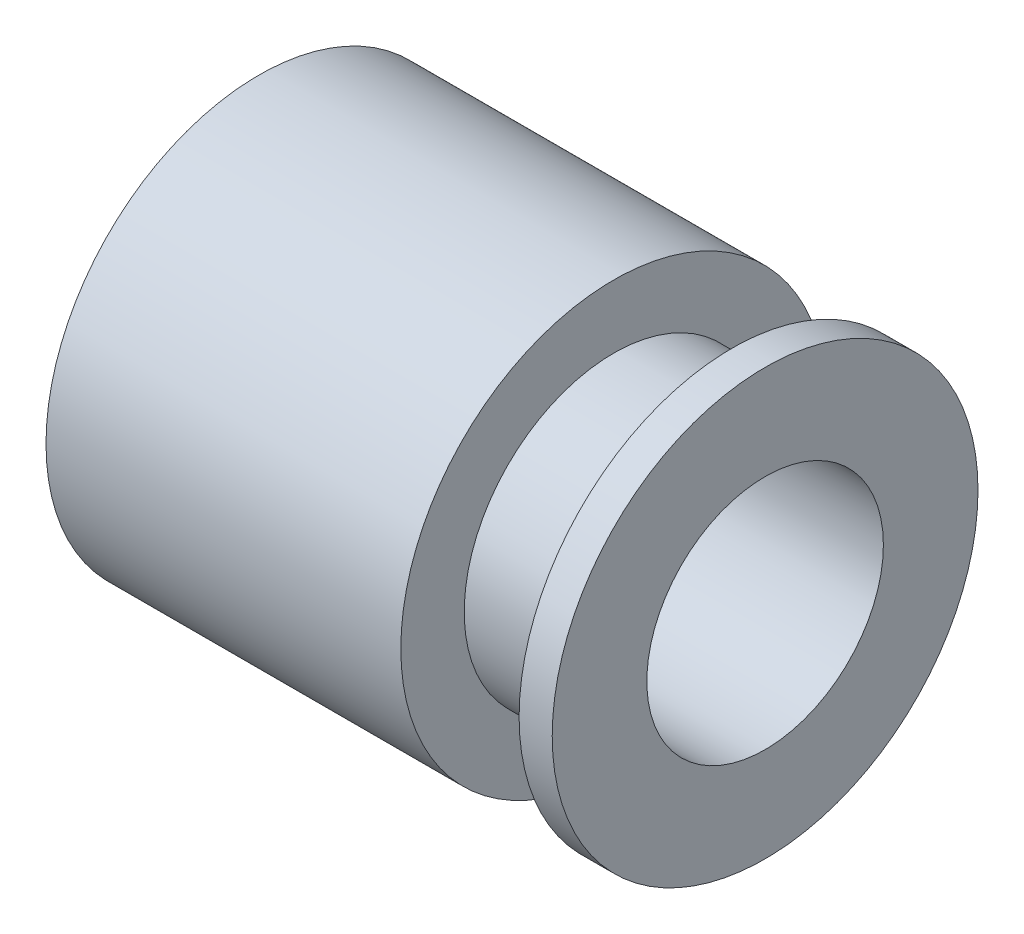
ISO-10303-21;
HEADER;
FILE_DESCRIPTION(('STEP AP214'),'2;1');
FILE_NAME('part.step','',(''),(''),'','','');
FILE_SCHEMA(('AUTOMOTIVE_DESIGN { 1 0 10303 214 1 1 1 1 }'));
ENDSEC;
DATA;
#1=APPLICATION_CONTEXT('core data for automotive mechanical design processes');
#2=APPLICATION_PROTOCOL_DEFINITION('international standard','automotive_design',2000,#1);
#3=PRODUCT_CONTEXT('',#1,'mechanical');
#4=PRODUCT('Part','Part','',(#3));
#5=PRODUCT_RELATED_PRODUCT_CATEGORY('part','',(#4));
#6=PRODUCT_DEFINITION_FORMATION('','',#4);
#7=PRODUCT_DEFINITION_CONTEXT('part definition',#1,'design');
#8=PRODUCT_DEFINITION('design','',#6,#7);
#9=PRODUCT_DEFINITION_SHAPE('','',#8);
#10=(LENGTH_UNIT() NAMED_UNIT(*) SI_UNIT(.MILLI.,.METRE.));
#11=(NAMED_UNIT(*) PLANE_ANGLE_UNIT() SI_UNIT($,.RADIAN.));
#12=(NAMED_UNIT(*) SI_UNIT($,.STERADIAN.) SOLID_ANGLE_UNIT());
#13=UNCERTAINTY_MEASURE_WITH_UNIT(LENGTH_MEASURE(1.E-05),#10,'distance_accuracy_value','');
#14=(GEOMETRIC_REPRESENTATION_CONTEXT(3) GLOBAL_UNCERTAINTY_ASSIGNED_CONTEXT((#13)) GLOBAL_UNIT_ASSIGNED_CONTEXT((#10,
#11,#12)) REPRESENTATION_CONTEXT('',''));
#15=CARTESIAN_POINT('',(0.,0.,0.));
#16=DIRECTION('',(0.,0.,1.));
#17=DIRECTION('',(1.,0.,0.));
#18=AXIS2_PLACEMENT_3D('',#15,#16,#17);
#19=CARTESIAN_POINT('',(0.,0.,0.));
#20=DIRECTION('',(1.,0.,0.));
#21=DIRECTION('',(0.,0.,-1.));
#22=AXIS2_PLACEMENT_3D('',#19,#20,#21);
#23=CYLINDRICAL_SURFACE('',#22,3.175);
#24=CARTESIAN_POINT('',(13.589,0.,0.));
#25=DIRECTION('',(1.,0.,0.));
#26=DIRECTION('',(0.,0.,-1.));
#27=AXIS2_PLACEMENT_3D('',#24,#25,#26);
#28=CIRCLE('',#27,3.175);
#29=CARTESIAN_POINT('',(13.589,0.,-3.175));
#30=VERTEX_POINT('',#29);
#31=EDGE_CURVE('E55',#30,#30,#28,.T.);
#32=ORIENTED_EDGE('',*,*,#31,.T.);
#33=EDGE_LOOP('',(#32));
#34=FACE_BOUND('',#33,.T.);
#35=CARTESIAN_POINT('',(8.255,0.,0.));
#36=DIRECTION('',(-1.,0.,0.));
#37=DIRECTION('',(0.,0.,1.));
#38=AXIS2_PLACEMENT_3D('',#35,#36,#37);
#39=CIRCLE('',#38,3.175);
#40=CARTESIAN_POINT('',(8.255,0.,3.175));
#41=VERTEX_POINT('',#40);
#42=EDGE_CURVE('E35',#41,#41,#39,.F.);
#43=ORIENTED_EDGE('',*,*,#42,.F.);
#44=EDGE_LOOP('',(#43));
#45=FACE_BOUND('',#44,.T.);
#46=ADVANCED_FACE('F31',(#34,#45),#23,.F.);
#47=CARTESIAN_POINT('',(9.525,0.,0.));
#48=DIRECTION('',(1.,0.,0.));
#49=DIRECTION('',(0.,0.,-1.));
#50=AXIS2_PLACEMENT_3D('',#47,#48,#49);
#51=PLANE('',#50);
#52=CARTESIAN_POINT('',(9.525,0.,0.));
#53=DIRECTION('',(1.,0.,0.));
#54=DIRECTION('',(0.,0.,-1.));
#55=AXIS2_PLACEMENT_3D('',#52,#53,#54);
#56=CIRCLE('',#55,5.715);
#57=CARTESIAN_POINT('',(9.525,0.,5.715));
#58=VERTEX_POINT('',#57);
#59=EDGE_CURVE('E10',#58,#58,#56,.T.);
#60=ORIENTED_EDGE('',*,*,#59,.T.);
#61=EDGE_LOOP('',(#60));
#62=FACE_BOUND('',#61,.T.);
#63=CARTESIAN_POINT('',(9.525,0.,0.));
#64=DIRECTION('',(1.,0.,0.));
#65=DIRECTION('',(0.,0.,-1.));
#66=AXIS2_PLACEMENT_3D('',#63,#64,#65);
#67=CIRCLE('',#66,4.0132);
#68=CARTESIAN_POINT('',(9.525,0.,-4.0132));
#69=VERTEX_POINT('',#68);
#70=EDGE_CURVE('E46',#69,#69,#67,.T.);
#71=ORIENTED_EDGE('',*,*,#70,.F.);
#72=EDGE_LOOP('',(#71));
#73=FACE_BOUND('',#72,.T.);
#74=ADVANCED_FACE('F73',(#62,#73),#51,.T.);
#75=CARTESIAN_POINT('',(9.525,0.,0.));
#76=DIRECTION('',(-1.,0.,0.));
#77=DIRECTION('',(0.,0.,1.));
#78=AXIS2_PLACEMENT_3D('',#75,#76,#77);
#79=CYLINDRICAL_SURFACE('',#78,5.715);
#80=CARTESIAN_POINT('',(0.,0.,0.));
#81=DIRECTION('',(1.,0.,0.));
#82=DIRECTION('',(0.,0.,-1.));
#83=AXIS2_PLACEMENT_3D('',#80,#81,#82);
#84=CIRCLE('',#83,5.715);
#85=CARTESIAN_POINT('',(0.,0.,5.715));
#86=VERTEX_POINT('',#85);
#87=EDGE_CURVE('E39',#86,#86,#84,.T.);
#88=CARTESIAN_POINT('',(9.525,0.,5.715));
#89=CARTESIAN_POINT('',(9.42578125,0.,5.715));
#90=CARTESIAN_POINT('',(9.3265625,0.,5.715));
#91=CARTESIAN_POINT('',(9.128125,0.,5.715));
#92=CARTESIAN_POINT('',(9.02890625,0.,5.715));
#93=CARTESIAN_POINT('',(8.83046875,0.,5.715));
#94=CARTESIAN_POINT('',(8.73125,0.,5.715));
#95=CARTESIAN_POINT('',(8.5328125,0.,5.715));
#96=CARTESIAN_POINT('',(8.43359375,0.,5.715));
#97=CARTESIAN_POINT('',(8.23515625,0.,5.715));
#98=CARTESIAN_POINT('',(8.1359375,0.,5.715));
#99=CARTESIAN_POINT('',(7.9375,0.,5.715));
#100=CARTESIAN_POINT('',(7.83828125,0.,5.715));
#101=CARTESIAN_POINT('',(7.63984375,0.,5.715));
#102=CARTESIAN_POINT('',(7.540625,0.,5.715));
#103=CARTESIAN_POINT('',(7.3421875,0.,5.715));
#104=CARTESIAN_POINT('',(7.24296875,0.,5.715));
#105=CARTESIAN_POINT('',(7.04453125,0.,5.715));
#106=CARTESIAN_POINT('',(6.9453125,0.,5.715));
#107=CARTESIAN_POINT('',(6.746875,0.,5.715));
#108=CARTESIAN_POINT('',(6.64765625,0.,5.715));
#109=CARTESIAN_POINT('',(6.44921875,0.,5.715));
#110=CARTESIAN_POINT('',(6.35,0.,5.715));
#111=CARTESIAN_POINT('',(6.1515625,0.,5.715));
#112=CARTESIAN_POINT('',(6.05234375,0.,5.715));
#113=CARTESIAN_POINT('',(5.85390625,0.,5.715));
#114=CARTESIAN_POINT('',(5.7546875,0.,5.715));
#115=CARTESIAN_POINT('',(5.55625,0.,5.715));
#116=CARTESIAN_POINT('',(5.45703125,0.,5.715));
#117=CARTESIAN_POINT('',(5.25859375,0.,5.715));
#118=CARTESIAN_POINT('',(5.159375,0.,5.715));
#119=CARTESIAN_POINT('',(4.9609375,0.,5.715));
#120=CARTESIAN_POINT('',(4.86171875,0.,5.715));
#121=CARTESIAN_POINT('',(4.66328125,0.,5.715));
#122=CARTESIAN_POINT('',(4.5640625,0.,5.715));
#123=CARTESIAN_POINT('',(4.365625,0.,5.715));
#124=CARTESIAN_POINT('',(4.26640625,0.,5.715));
#125=CARTESIAN_POINT('',(4.06796875,0.,5.715));
#126=CARTESIAN_POINT('',(3.96875,0.,5.715));
#127=CARTESIAN_POINT('',(3.7703125,0.,5.715));
#128=CARTESIAN_POINT('',(3.67109375,0.,5.715));
#129=CARTESIAN_POINT('',(3.47265625,0.,5.715));
#130=CARTESIAN_POINT('',(3.3734375,0.,5.715));
#131=CARTESIAN_POINT('',(3.175,0.,5.715));
#132=CARTESIAN_POINT('',(3.07578125,0.,5.715));
#133=CARTESIAN_POINT('',(2.87734375,0.,5.715));
#134=CARTESIAN_POINT('',(2.778125,0.,5.715));
#135=CARTESIAN_POINT('',(2.5796875,0.,5.715));
#136=CARTESIAN_POINT('',(2.48046875,0.,5.715));
#137=CARTESIAN_POINT('',(2.28203125,0.,5.715));
#138=CARTESIAN_POINT('',(2.1828125,0.,5.715));
#139=CARTESIAN_POINT('',(1.984375,0.,5.715));
#140=CARTESIAN_POINT('',(1.88515625,0.,5.715));
#141=CARTESIAN_POINT('',(1.68671875,0.,5.715));
#142=CARTESIAN_POINT('',(1.5875,0.,5.715));
#143=CARTESIAN_POINT('',(1.3890625,0.,5.715));
#144=CARTESIAN_POINT('',(1.28984375,0.,5.715));
#145=CARTESIAN_POINT('',(1.09140625,0.,5.715));
#146=CARTESIAN_POINT('',(0.992187500000001,0.,5.715));
#147=CARTESIAN_POINT('',(0.793750000000001,0.,5.715));
#148=CARTESIAN_POINT('',(0.69453125,0.,5.715));
#149=CARTESIAN_POINT('',(0.49609375,0.,5.715));
#150=CARTESIAN_POINT('',(0.396875,0.,5.715));
#151=CARTESIAN_POINT('',(0.1984375,0.,5.715));
#152=CARTESIAN_POINT('',(0.0992187500000001,0.,5.715));
#153=CARTESIAN_POINT('',(0.,0.,5.715));
#154=B_SPLINE_CURVE_WITH_KNOTS('',3,(#88,#89,#90,#91,#92,#93,#94,#95,#96,#97,#98,#99,#100,#101,
#102,#103,#104,#105,#106,#107,#108,#109,#110,#111,#112,#113,#114,#115,#116,#117,#118,#119,#120,
#121,#122,#123,#124,#125,#126,#127,#128,#129,#130,#131,#132,#133,#134,#135,#136,#137,#138,#139,
#140,#141,#142,#143,#144,#145,#146,#147,#148,#149,#150,#151,#152,#153),.UNSPECIFIED.,.F.,.F.,(4,
2,2,2,2,2,2,2,2,2,2,2,2,2,2,2,2,2,2,2,2,2,2,2,2,2,2,2,2,2,2,2,4),(0.,0.297656249999998,
0.595312499999999,0.892968749999999,1.190625,1.48828125,1.7859375,2.08359375,2.38125,2.67890625,
2.9765625,3.27421875,3.571875,3.86953125,4.1671875,4.46484375,4.7625,5.06015625,5.3578125,
5.65546875,5.953125,6.25078125,6.5484375,6.84609375,7.14375,7.44140625,7.7390625,8.03671875,
8.334375,8.63203125,8.9296875,9.22734375,9.525),.UNSPECIFIED.);
#155=EDGE_CURVE('BSEAM33',#58,#86,#154,.T.);
#156=ORIENTED_EDGE('',*,*,#59,.F.);
#157=ORIENTED_EDGE('',*,*,#87,.T.);
#158=ORIENTED_EDGE('',*,*,#155,.T.);
#159=ORIENTED_EDGE('',*,*,#155,.F.);
#160=EDGE_LOOP('',(#156,#158,#157,#159));
#161=FACE_BOUND('',#160,.T.);
#162=ADVANCED_FACE('F33',(#161),#79,.T.);
#163=CARTESIAN_POINT('',(0.,0.,0.));
#164=DIRECTION('',(1.,0.,0.));
#165=DIRECTION('',(0.,0.,-1.));
#166=AXIS2_PLACEMENT_3D('',#163,#164,#165);
#167=PLANE('',#166);
#168=CARTESIAN_POINT('',(0.,0.,0.));
#169=DIRECTION('',(-1.,0.,0.));
#170=DIRECTION('',(0.,0.,1.));
#171=AXIS2_PLACEMENT_3D('',#168,#169,#170);
#172=CIRCLE('',#171,4.0386);
#173=CARTESIAN_POINT('',(0.,0.,4.0386));
#174=VERTEX_POINT('',#173);
#175=EDGE_CURVE('E60',#174,#174,#172,.T.);
#176=ORIENTED_EDGE('',*,*,#175,.F.);
#177=EDGE_LOOP('',(#176));
#178=FACE_BOUND('',#177,.T.);
#179=ORIENTED_EDGE('',*,*,#87,.F.);
#180=EDGE_LOOP('',(#179));
#181=FACE_BOUND('',#180,.T.);
#182=ADVANCED_FACE('F98',(#178,#181),#167,.F.);
#183=CARTESIAN_POINT('',(12.7,0.,0.));
#184=DIRECTION('',(-1.,0.,0.));
#185=DIRECTION('',(0.,0.,1.));
#186=AXIS2_PLACEMENT_3D('',#183,#184,#185);
#187=CYLINDRICAL_SURFACE('',#186,4.0132);
#188=CARTESIAN_POINT('',(12.7,0.,0.));
#189=DIRECTION('',(1.,0.,0.));
#190=DIRECTION('',(0.,0.,-1.));
#191=AXIS2_PLACEMENT_3D('',#188,#189,#190);
#192=CIRCLE('',#191,4.0132);
#193=CARTESIAN_POINT('',(12.7,0.,-4.0132));
#194=VERTEX_POINT('',#193);
#195=EDGE_CURVE('E44',#194,#194,#192,.T.);
#196=ORIENTED_EDGE('',*,*,#195,.F.);
#197=EDGE_LOOP('',(#196));
#198=FACE_BOUND('',#197,.T.);
#199=ORIENTED_EDGE('',*,*,#70,.T.);
#200=EDGE_LOOP('',(#199));
#201=FACE_BOUND('',#200,.T.);
#202=ADVANCED_FACE('F92',(#198,#201),#187,.T.);
#203=CARTESIAN_POINT('',(12.7,0.,0.));
#204=DIRECTION('',(1.,0.,0.));
#205=DIRECTION('',(0.,0.,-1.));
#206=AXIS2_PLACEMENT_3D('',#203,#204,#205);
#207=PLANE('',#206);
#208=CARTESIAN_POINT('',(12.7,0.,0.));
#209=DIRECTION('',(1.,0.,0.));
#210=DIRECTION('',(0.,0.,-1.));
#211=AXIS2_PLACEMENT_3D('',#208,#209,#210);
#212=CIRCLE('',#211,5.715);
#213=CARTESIAN_POINT('',(12.7,0.,-5.715));
#214=VERTEX_POINT('',#213);
#215=EDGE_CURVE('E52',#214,#214,#212,.T.);
#216=ORIENTED_EDGE('',*,*,#215,.F.);
#217=EDGE_LOOP('',(#216));
#218=FACE_BOUND('',#217,.T.);
#219=ORIENTED_EDGE('',*,*,#195,.T.);
#220=EDGE_LOOP('',(#219));
#221=FACE_BOUND('',#220,.T.);
#222=ADVANCED_FACE('F89',(#218,#221),#207,.F.);
#223=CARTESIAN_POINT('',(13.589,0.,0.));
#224=DIRECTION('',(-1.,0.,0.));
#225=DIRECTION('',(0.,0.,1.));
#226=AXIS2_PLACEMENT_3D('',#223,#224,#225);
#227=CYLINDRICAL_SURFACE('',#226,5.715);
#228=CARTESIAN_POINT('',(13.589,0.,0.));
#229=DIRECTION('',(1.,0.,0.));
#230=DIRECTION('',(0.,0.,-1.));
#231=AXIS2_PLACEMENT_3D('',#228,#229,#230);
#232=CIRCLE('',#231,5.715);
#233=CARTESIAN_POINT('',(13.589,0.,-5.715));
#234=VERTEX_POINT('',#233);
#235=EDGE_CURVE('E49',#234,#234,#232,.T.);
#236=ORIENTED_EDGE('',*,*,#235,.F.);
#237=EDGE_LOOP('',(#236));
#238=FACE_BOUND('',#237,.T.);
#239=ORIENTED_EDGE('',*,*,#215,.T.);
#240=EDGE_LOOP('',(#239));
#241=FACE_BOUND('',#240,.T.);
#242=ADVANCED_FACE('F87',(#238,#241),#227,.T.);
#243=CARTESIAN_POINT('',(13.589,0.,0.));
#244=DIRECTION('',(1.,0.,0.));
#245=DIRECTION('',(0.,0.,-1.));
#246=AXIS2_PLACEMENT_3D('',#243,#244,#245);
#247=PLANE('',#246);
#248=ORIENTED_EDGE('',*,*,#31,.F.);
#249=EDGE_LOOP('',(#248));
#250=FACE_BOUND('',#249,.T.);
#251=ORIENTED_EDGE('',*,*,#235,.T.);
#252=EDGE_LOOP('',(#251));
#253=FACE_BOUND('',#252,.T.);
#254=ADVANCED_FACE('F84',(#250,#253),#247,.T.);
#255=CARTESIAN_POINT('',(8.255,0.,0.));
#256=DIRECTION('',(-1.,0.,0.));
#257=DIRECTION('',(0.,0.,1.));
#258=AXIS2_PLACEMENT_3D('',#255,#256,#257);
#259=PLANE('',#258);
#260=CARTESIAN_POINT('',(8.255,0.,0.));
#261=DIRECTION('',(-1.,0.,0.));
#262=DIRECTION('',(0.,0.,1.));
#263=AXIS2_PLACEMENT_3D('',#260,#261,#262);
#264=CIRCLE('',#263,4.0386);
#265=CARTESIAN_POINT('',(8.255,0.,4.0386));
#266=VERTEX_POINT('',#265);
#267=EDGE_CURVE('E63',#266,#266,#264,.T.);
#268=ORIENTED_EDGE('',*,*,#267,.T.);
#269=EDGE_LOOP('',(#268));
#270=FACE_BOUND('',#269,.T.);
#271=ORIENTED_EDGE('',*,*,#42,.T.);
#272=EDGE_LOOP('',(#271));
#273=FACE_BOUND('',#272,.T.);
#274=ADVANCED_FACE('F70',(#270,#273),#259,.T.);
#275=CARTESIAN_POINT('',(8.255,0.,0.));
#276=DIRECTION('',(-1.,0.,0.));
#277=DIRECTION('',(0.,0.,1.));
#278=AXIS2_PLACEMENT_3D('',#275,#276,#277);
#279=CYLINDRICAL_SURFACE('',#278,4.0386);
#280=ORIENTED_EDGE('',*,*,#267,.F.);
#281=EDGE_LOOP('',(#280));
#282=FACE_BOUND('',#281,.T.);
#283=ORIENTED_EDGE('',*,*,#175,.T.);
#284=EDGE_LOOP('',(#283));
#285=FACE_BOUND('',#284,.T.);
#286=ADVANCED_FACE('F82',(#282,#285),#279,.F.);
#287=CLOSED_SHELL('',(#46,#74,#162,#182,#202,#222,#242,#254,#274,#286));
#288=MANIFOLD_SOLID_BREP('B2',#287);
#289=ADVANCED_BREP_SHAPE_REPRESENTATION('',(#18,#288),#14);
#290=SHAPE_DEFINITION_REPRESENTATION(#9,#289);
ENDSEC;
END-ISO-10303-21;
